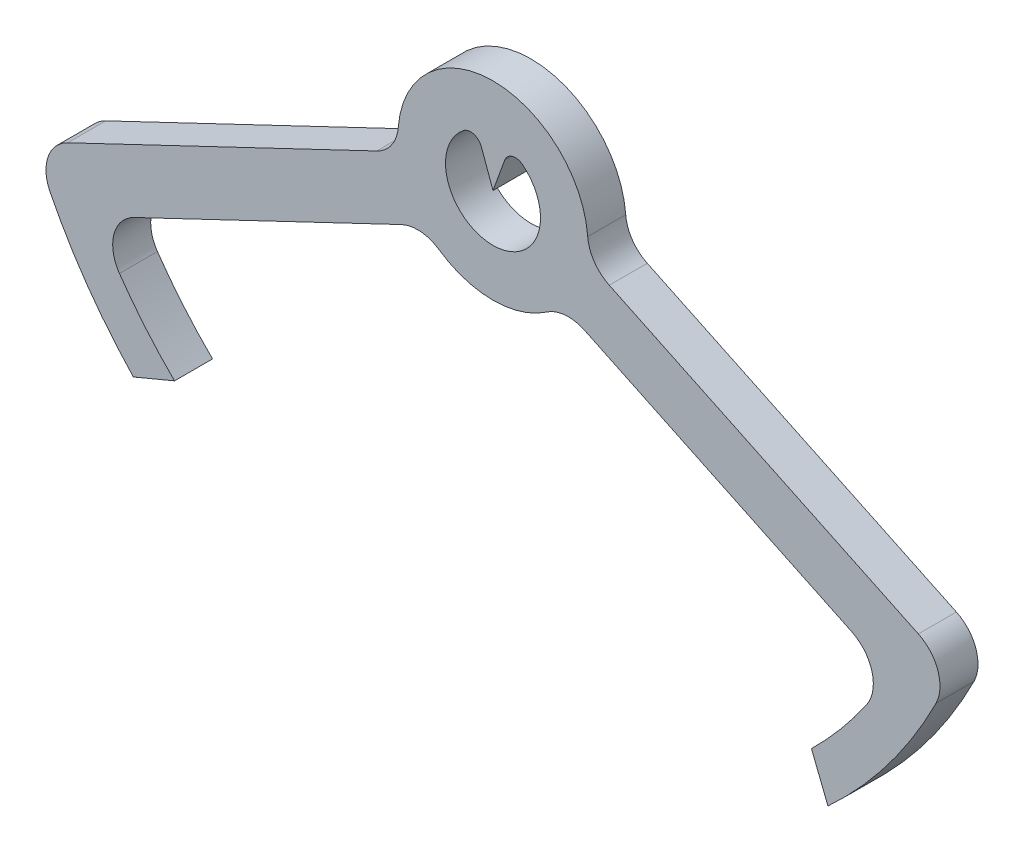
ISO-10303-21;
HEADER;
FILE_DESCRIPTION(('STEP AP214'),'2;1');
FILE_NAME('part.step','',(''),(''),'','','');
FILE_SCHEMA(('AUTOMOTIVE_DESIGN { 1 0 10303 214 1 1 1 1 }'));
ENDSEC;
DATA;
#1=APPLICATION_CONTEXT('core data for automotive mechanical design processes');
#2=APPLICATION_PROTOCOL_DEFINITION('international standard','automotive_design',2000,#1);
#3=PRODUCT_CONTEXT('',#1,'mechanical');
#4=PRODUCT('Part','Part','',(#3));
#5=PRODUCT_RELATED_PRODUCT_CATEGORY('part','',(#4));
#6=PRODUCT_DEFINITION_FORMATION('','',#4);
#7=PRODUCT_DEFINITION_CONTEXT('part definition',#1,'design');
#8=PRODUCT_DEFINITION('design','',#6,#7);
#9=PRODUCT_DEFINITION_SHAPE('','',#8);
#10=(LENGTH_UNIT() NAMED_UNIT(*) SI_UNIT(.MILLI.,.METRE.));
#11=(NAMED_UNIT(*) PLANE_ANGLE_UNIT() SI_UNIT($,.RADIAN.));
#12=(NAMED_UNIT(*) SI_UNIT($,.STERADIAN.) SOLID_ANGLE_UNIT());
#13=UNCERTAINTY_MEASURE_WITH_UNIT(LENGTH_MEASURE(1.E-05),#10,'distance_accuracy_value','');
#14=(GEOMETRIC_REPRESENTATION_CONTEXT(3) GLOBAL_UNCERTAINTY_ASSIGNED_CONTEXT((#13)) GLOBAL_UNIT_ASSIGNED_CONTEXT((#10,
#11,#12)) REPRESENTATION_CONTEXT('',''));
#15=CARTESIAN_POINT('',(0.,0.,0.));
#16=DIRECTION('',(0.,0.,1.));
#17=DIRECTION('',(1.,0.,0.));
#18=AXIS2_PLACEMENT_3D('',#15,#16,#17);
#19=CARTESIAN_POINT('',(0.,0.,10.));
#20=DIRECTION('',(0.,0.,-1.));
#21=DIRECTION('',(-1.,0.,0.));
#22=AXIS2_PLACEMENT_3D('',#19,#20,#21);
#23=CYLINDRICAL_SURFACE('',#22,12.5);
#24=CARTESIAN_POINT('',(0.,0.,10.));
#25=DIRECTION('',(0.,0.,1.));
#26=DIRECTION('',(1.,0.,0.));
#27=AXIS2_PLACEMENT_3D('',#24,#25,#26);
#28=CIRCLE('',#27,12.5);
#29=CARTESIAN_POINT('',(-7.76579706889906,9.79501893232876,10.));
#30=VERTEX_POINT('',#29);
#31=CARTESIAN_POINT('',(7.76579706889912,9.79501893232871,10.));
#32=VERTEX_POINT('',#31);
#33=EDGE_CURVE('E250',#30,#32,#28,.T.);
#34=ORIENTED_EDGE('',*,*,#33,.T.);
#35=DIRECTION('',(0.,0.,-1.));
#36=VECTOR('',#35,1.);
#37=CARTESIAN_POINT('',(7.76579706889912,9.79501893232871,10.));
#38=LINE('',#37,#36);
#39=CARTESIAN_POINT('',(7.76579706889912,9.79501893232871,0.));
#40=VERTEX_POINT('',#39);
#41=EDGE_CURVE('E378',#32,#40,#38,.T.);
#42=ORIENTED_EDGE('',*,*,#41,.T.);
#43=CARTESIAN_POINT('',(0.,0.,0.));
#44=DIRECTION('',(0.,0.,1.));
#45=DIRECTION('',(1.,0.,0.));
#46=AXIS2_PLACEMENT_3D('',#43,#44,#45);
#47=CIRCLE('',#46,12.5);
#48=CARTESIAN_POINT('',(-7.76579706889906,9.79501893232876,0.));
#49=VERTEX_POINT('',#48);
#50=EDGE_CURVE('E288',#49,#40,#47,.T.);
#51=ORIENTED_EDGE('',*,*,#50,.F.);
#52=DIRECTION('',(0.,0.,-1.));
#53=VECTOR('',#52,1.);
#54=CARTESIAN_POINT('',(-7.76579706889906,9.79501893232876,10.));
#55=LINE('',#54,#53);
#56=EDGE_CURVE('E376',#49,#30,#55,.F.);
#57=ORIENTED_EDGE('',*,*,#56,.T.);
#58=EDGE_LOOP('',(#34,#42,#51,#57));
#59=FACE_BOUND('',#58,.T.);
#60=ADVANCED_FACE('F35',(#59),#23,.F.);
#61=CARTESIAN_POINT('',(0.,0.,10.));
#62=DIRECTION('',(0.93969262078591,0.342020143325663,0.));
#63=DIRECTION('',(-0.342020143325663,0.939692620785911,0.));
#64=AXIS2_PLACEMENT_3D('',#61,#62,#63);
#65=PLANE('',#64);
#66=DIRECTION('',(0.342020143325663,-0.939692620785911,0.));
#67=VECTOR('',#66,1.);
#68=CARTESIAN_POINT('',(0.,0.,10.));
#69=LINE('',#68,#67);
#70=CARTESIAN_POINT('',(-3.08292791000555,8.47027481854685,10.));
#71=VERTEX_POINT('',#70);
#72=CARTESIAN_POINT('',(0.,0.,10.));
#73=VERTEX_POINT('',#72);
#74=EDGE_CURVE('E253',#71,#73,#69,.T.);
#75=ORIENTED_EDGE('',*,*,#74,.F.);
#76=DIRECTION('',(0.,0.,-1.));
#77=VECTOR('',#76,1.);
#78=CARTESIAN_POINT('',(-3.08292791000555,8.47027481854685,10.));
#79=LINE('',#78,#77);
#80=CARTESIAN_POINT('',(-3.08292791000555,8.47027481854685,0.));
#81=VERTEX_POINT('',#80);
#82=EDGE_CURVE('E383',#71,#81,#79,.T.);
#83=ORIENTED_EDGE('',*,*,#82,.T.);
#84=DIRECTION('',(0.342020143325663,-0.939692620785911,0.));
#85=VECTOR('',#84,1.);
#86=CARTESIAN_POINT('',(0.,0.,0.));
#87=LINE('',#86,#85);
#88=CARTESIAN_POINT('',(0.,0.,0.));
#89=VERTEX_POINT('',#88);
#90=EDGE_CURVE('E291',#81,#89,#87,.T.);
#91=ORIENTED_EDGE('',*,*,#90,.T.);
#92=DIRECTION('',(0.,0.,-1.));
#93=VECTOR('',#92,1.);
#94=CARTESIAN_POINT('',(0.,0.,10.));
#95=LINE('',#94,#93);
#96=EDGE_CURVE('E212',#73,#89,#95,.T.);
#97=ORIENTED_EDGE('',*,*,#96,.F.);
#98=EDGE_LOOP('',(#75,#83,#91,#97));
#99=FACE_BOUND('',#98,.T.);
#100=ADVANCED_FACE('F396',(#99),#65,.F.);
#101=CARTESIAN_POINT('',(3.22885710080164,-6.76937824490575,10.));
#102=DIRECTION('',(-0.430514280106884,0.90258376598743,0.));
#103=DIRECTION('',(-0.90258376598743,-0.430514280106884,0.));
#104=AXIS2_PLACEMENT_3D('',#101,#102,#103);
#105=PLANE('',#104);
#106=DIRECTION('',(0.90258376598743,0.430514280106884,0.));
#107=VECTOR('',#106,1.);
#108=CARTESIAN_POINT('',(3.22885710080164,-6.76937824490575,10.));
#109=LINE('',#108,#107);
#110=CARTESIAN_POINT('',(-94.3776142828172,-53.325699491744,10.));
#111=VERTEX_POINT('',#110);
#112=CARTESIAN_POINT('',(-24.1292593627974,-19.8186488591643,10.));
#113=VERTEX_POINT('',#112);
#114=EDGE_CURVE('E296',#111,#113,#109,.T.);
#115=ORIENTED_EDGE('',*,*,#114,.F.);
#116=DIRECTION('',(0.,0.,1.));
#117=VECTOR('',#116,1.);
#118=CARTESIAN_POINT('',(-94.3776142828172,-53.325699491744,0.));
#119=LINE('',#118,#117);
#120=CARTESIAN_POINT('',(-94.3776142828172,-53.325699491744,0.));
#121=VERTEX_POINT('',#120);
#122=EDGE_CURVE('E359',#111,#121,#119,.F.);
#123=ORIENTED_EDGE('',*,*,#122,.T.);
#124=DIRECTION('',(0.90258376598743,0.430514280106884,0.));
#125=VECTOR('',#124,1.);
#126=CARTESIAN_POINT('',(3.22885710080164,-6.76937824490575,0.));
#127=LINE('',#126,#125);
#128=CARTESIAN_POINT('',(-24.1292593627974,-19.8186488591643,0.));
#129=VERTEX_POINT('',#128);
#130=EDGE_CURVE('E259',#121,#129,#127,.T.);
#131=ORIENTED_EDGE('',*,*,#130,.T.);
#132=DIRECTION('',(0.,0.,1.));
#133=VECTOR('',#132,1.);
#134=CARTESIAN_POINT('',(-24.1292593627974,-19.8186488591643,10.));
#135=LINE('',#134,#133);
#136=EDGE_CURVE('E308',#129,#113,#135,.T.);
#137=ORIENTED_EDGE('',*,*,#136,.T.);
#138=EDGE_LOOP('',(#115,#123,#131,#137));
#139=FACE_BOUND('',#138,.T.);
#140=ADVANCED_FACE('F419',(#139),#105,.F.);
#141=CARTESIAN_POINT('',(0.,0.,10.));
#142=DIRECTION('',(0.,0.,-1.));
#143=DIRECTION('',(-1.,0.,0.));
#144=AXIS2_PLACEMENT_3D('',#141,#142,#143);
#145=CYLINDRICAL_SURFACE('',#144,25.);
#146=CARTESIAN_POINT('',(0.,0.,10.));
#147=DIRECTION('',(0.,0.,1.));
#148=DIRECTION('',(1.,0.,0.));
#149=AXIS2_PLACEMENT_3D('',#146,#147,#148);
#150=CIRCLE('',#149,25.);
#151=CARTESIAN_POINT('',(-14.1600832583775,-20.6032046564562,10.));
#152=VERTEX_POINT('',#151);
#153=CARTESIAN_POINT('',(14.1600832583774,-20.6032046564562,10.));
#154=VERTEX_POINT('',#153);
#155=EDGE_CURVE('E230',#152,#154,#150,.T.);
#156=ORIENTED_EDGE('',*,*,#155,.F.);
#157=DIRECTION('',(0.,0.,-1.));
#158=VECTOR('',#157,1.);
#159=CARTESIAN_POINT('',(-14.1600832583775,-20.6032046564562,10.));
#160=LINE('',#159,#158);
#161=CARTESIAN_POINT('',(-14.1600832583775,-20.6032046564562,0.));
#162=VERTEX_POINT('',#161);
#163=EDGE_CURVE('E305',#152,#162,#160,.T.);
#164=ORIENTED_EDGE('',*,*,#163,.T.);
#165=CARTESIAN_POINT('',(0.,0.,0.));
#166=DIRECTION('',(0.,0.,1.));
#167=DIRECTION('',(1.,0.,0.));
#168=AXIS2_PLACEMENT_3D('',#165,#166,#167);
#169=CIRCLE('',#168,25.);
#170=CARTESIAN_POINT('',(14.1600832583774,-20.6032046564562,0.));
#171=VERTEX_POINT('',#170);
#172=EDGE_CURVE('E261',#162,#171,#169,.T.);
#173=ORIENTED_EDGE('',*,*,#172,.T.);
#174=DIRECTION('',(0.,0.,-1.));
#175=VECTOR('',#174,1.);
#176=CARTESIAN_POINT('',(14.1600832583774,-20.6032046564562,10.));
#177=LINE('',#176,#175);
#178=EDGE_CURVE('E299',#171,#154,#177,.F.);
#179=ORIENTED_EDGE('',*,*,#178,.T.);
#180=EDGE_LOOP('',(#156,#164,#173,#179));
#181=FACE_BOUND('',#180,.T.);
#182=ADVANCED_FACE('F444',(#181),#145,.T.);
#183=CARTESIAN_POINT('',(-3.22885710080168,-6.76937824490571,10.));
#184=DIRECTION('',(0.43051428010689,0.902583765987427,0.));
#185=DIRECTION('',(-0.902583765987427,0.43051428010689,0.));
#186=AXIS2_PLACEMENT_3D('',#183,#184,#185);
#187=PLANE('',#186);
#188=DIRECTION('',(0.902583765987427,-0.43051428010689,0.));
#189=VECTOR('',#188,1.);
#190=CARTESIAN_POINT('',(-3.22885710080168,-6.76937824490571,0.));
#191=LINE('',#190,#189);
#192=CARTESIAN_POINT('',(24.1292593627972,-19.8186488591645,0.));
#193=VERTEX_POINT('',#192);
#194=CARTESIAN_POINT('',(94.3776142828168,-53.3256994917446,0.));
#195=VERTEX_POINT('',#194);
#196=EDGE_CURVE('E267',#193,#195,#191,.T.);
#197=ORIENTED_EDGE('',*,*,#196,.T.);
#198=DIRECTION('',(0.,0.,-1.));
#199=VECTOR('',#198,1.);
#200=CARTESIAN_POINT('',(94.3776142828168,-53.3256994917446,10.));
#201=LINE('',#200,#199);
#202=CARTESIAN_POINT('',(94.3776142828168,-53.3256994917446,10.));
#203=VERTEX_POINT('',#202);
#204=EDGE_CURVE('E357',#195,#203,#201,.F.);
#205=ORIENTED_EDGE('',*,*,#204,.T.);
#206=DIRECTION('',(0.902583765987427,-0.43051428010689,0.));
#207=VECTOR('',#206,1.);
#208=CARTESIAN_POINT('',(-3.22885710080168,-6.76937824490571,10.));
#209=LINE('',#208,#207);
#210=CARTESIAN_POINT('',(24.1292593627972,-19.8186488591645,10.));
#211=VERTEX_POINT('',#210);
#212=EDGE_CURVE('E228',#211,#203,#209,.T.);
#213=ORIENTED_EDGE('',*,*,#212,.F.);
#214=DIRECTION('',(0.,0.,1.));
#215=VECTOR('',#214,1.);
#216=CARTESIAN_POINT('',(24.1292593627972,-19.8186488591645,0.));
#217=LINE('',#216,#215);
#218=EDGE_CURVE('E311',#211,#193,#217,.F.);
#219=ORIENTED_EDGE('',*,*,#218,.T.);
#220=EDGE_LOOP('',(#197,#205,#213,#219));
#221=FACE_BOUND('',#220,.T.);
#222=ADVANCED_FACE('F456',(#221),#187,.F.);
#223=CARTESIAN_POINT('',(0.,0.,10.));
#224=DIRECTION('',(0.,0.,-1.));
#225=DIRECTION('',(-1.,0.,0.));
#226=AXIS2_PLACEMENT_3D('',#223,#224,#225);
#227=CYLINDRICAL_SURFACE('',#226,119.548);
#228=CARTESIAN_POINT('',(0.,0.,10.));
#229=DIRECTION('',(0.,0.,1.));
#230=DIRECTION('',(1.,0.,0.));
#231=AXIS2_PLACEMENT_3D('',#228,#229,#230);
#232=CIRCLE('',#231,119.548);
#233=CARTESIAN_POINT('',(83.792,-85.2679602195338,10.));
#234=VERTEX_POINT('',#233);
#235=CARTESIAN_POINT('',(98.2946637154489,-68.0432464618408,10.));
#236=VERTEX_POINT('',#235);
#237=EDGE_CURVE('E206',#234,#236,#232,.T.);
#238=ORIENTED_EDGE('',*,*,#237,.T.);
#239=DIRECTION('',(0.,0.,-1.));
#240=VECTOR('',#239,1.);
#241=CARTESIAN_POINT('',(98.2946637154489,-68.0432464618408,10.));
#242=LINE('',#241,#240);
#243=CARTESIAN_POINT('',(98.2946637154489,-68.0432464618408,0.));
#244=VERTEX_POINT('',#243);
#245=EDGE_CURVE('E355',#236,#244,#242,.T.);
#246=ORIENTED_EDGE('',*,*,#245,.T.);
#247=CARTESIAN_POINT('',(0.,0.,0.));
#248=DIRECTION('',(0.,0.,1.));
#249=DIRECTION('',(1.,0.,0.));
#250=AXIS2_PLACEMENT_3D('',#247,#248,#249);
#251=CIRCLE('',#250,119.548);
#252=CARTESIAN_POINT('',(83.792,-85.2679602195338,0.));
#253=VERTEX_POINT('',#252);
#254=EDGE_CURVE('E209',#253,#244,#251,.T.);
#255=ORIENTED_EDGE('',*,*,#254,.F.);
#256=DIRECTION('',(0.,0.,-1.));
#257=VECTOR('',#256,1.);
#258=CARTESIAN_POINT('',(83.792,-85.2679602195338,10.));
#259=LINE('',#258,#257);
#260=EDGE_CURVE('E201',#234,#253,#259,.T.);
#261=ORIENTED_EDGE('',*,*,#260,.F.);
#262=EDGE_LOOP('',(#238,#246,#255,#261));
#263=FACE_BOUND('',#262,.T.);
#264=ADVANCED_FACE('F203',(#263),#227,.F.);
#265=CARTESIAN_POINT('',(43.0668062153489,17.1285523734378,10.));
#266=DIRECTION('',(0.929205277797289,0.369564002188611,0.));
#267=DIRECTION('',(-0.369564002188611,0.929205277797289,0.));
#268=AXIS2_PLACEMENT_3D('',#265,#266,#267);
#269=PLANE('',#268);
#270=DIRECTION('',(0.369564002188611,-0.929205277797289,0.));
#271=VECTOR('',#270,1.);
#272=CARTESIAN_POINT('',(43.0668062153489,17.1285523734378,0.));
#273=LINE('',#272,#271);
#274=CARTESIAN_POINT('',(88.1317794736216,-96.1795911345693,0.));
#275=VERTEX_POINT('',#274);
#276=EDGE_CURVE('E271',#253,#275,#273,.T.);
#277=ORIENTED_EDGE('',*,*,#276,.T.);
#278=DIRECTION('',(0.,0.,-1.));
#279=VECTOR('',#278,1.);
#280=CARTESIAN_POINT('',(88.1317794736216,-96.1795911345693,10.));
#281=LINE('',#280,#279);
#282=CARTESIAN_POINT('',(88.1317794736216,-96.1795911345693,10.));
#283=VERTEX_POINT('',#282);
#284=EDGE_CURVE('E213',#283,#275,#281,.T.);
#285=ORIENTED_EDGE('',*,*,#284,.F.);
#286=DIRECTION('',(0.369564002188611,-0.929205277797289,0.));
#287=VECTOR('',#286,1.);
#288=CARTESIAN_POINT('',(43.0668062153489,17.1285523734378,10.));
#289=LINE('',#288,#287);
#290=EDGE_CURVE('E216',#234,#283,#289,.T.);
#291=ORIENTED_EDGE('',*,*,#290,.F.);
#292=ORIENTED_EDGE('',*,*,#260,.T.);
#293=EDGE_LOOP('',(#277,#285,#291,#292));
#294=FACE_BOUND('',#293,.T.);
#295=ADVANCED_FACE('F217',(#294),#269,.F.);
#296=CARTESIAN_POINT('',(0.,0.,10.));
#297=DIRECTION('',(0.,0.,-1.));
#298=DIRECTION('',(-1.,0.,0.));
#299=AXIS2_PLACEMENT_3D('',#296,#297,#298);
#300=CYLINDRICAL_SURFACE('',#299,130.452);
#301=CARTESIAN_POINT('',(0.,0.,0.));
#302=DIRECTION('',(0.,0.,1.));
#303=DIRECTION('',(1.,0.,0.));
#304=AXIS2_PLACEMENT_3D('',#301,#302,#303);
#305=CIRCLE('',#304,130.452);
#306=CARTESIAN_POINT('',(116.552854457499,-58.5931431296278,0.));
#307=VERTEX_POINT('',#306);
#308=EDGE_CURVE('E273',#275,#307,#305,.T.);
#309=ORIENTED_EDGE('',*,*,#308,.T.);
#310=DIRECTION('',(0.,0.,-1.));
#311=VECTOR('',#310,1.);
#312=CARTESIAN_POINT('',(116.552854457499,-58.5931431296278,10.));
#313=LINE('',#312,#311);
#314=CARTESIAN_POINT('',(116.552854457499,-58.5931431296278,10.));
#315=VERTEX_POINT('',#314);
#316=EDGE_CURVE('E349',#307,#315,#313,.F.);
#317=ORIENTED_EDGE('',*,*,#316,.T.);
#318=CARTESIAN_POINT('',(0.,0.,10.));
#319=DIRECTION('',(0.,0.,1.));
#320=DIRECTION('',(1.,0.,0.));
#321=AXIS2_PLACEMENT_3D('',#318,#319,#320);
#322=CIRCLE('',#321,130.452);
#323=EDGE_CURVE('E222',#283,#315,#322,.T.);
#324=ORIENTED_EDGE('',*,*,#323,.F.);
#325=ORIENTED_EDGE('',*,*,#284,.T.);
#326=EDGE_LOOP('',(#309,#317,#324,#325));
#327=FACE_BOUND('',#326,.T.);
#328=ADVANCED_FACE('F447',(#327),#300,.T.);
#329=CARTESIAN_POINT('',(3.22885710080168,6.7693782449057,10.));
#330=DIRECTION('',(0.43051428010689,0.902583765987427,0.));
#331=DIRECTION('',(-0.902583765987427,0.43051428010689,0.));
#332=AXIS2_PLACEMENT_3D('',#329,#330,#331);
#333=PLANE('',#332);
#334=DIRECTION('',(0.902583765987427,-0.43051428010689,0.));
#335=VECTOR('',#334,1.);
#336=CARTESIAN_POINT('',(3.22885710080168,6.7693782449057,10.));
#337=LINE('',#336,#335);
#338=CARTESIAN_POINT('',(30.5869735644006,-6.27989236935308,10.));
#339=VERTEX_POINT('',#338);
#340=CARTESIAN_POINT('',(111.923457776038,-45.0757573808298,10.));
#341=VERTEX_POINT('',#340);
#342=EDGE_CURVE('E235',#339,#341,#337,.T.);
#343=ORIENTED_EDGE('',*,*,#342,.T.);
#344=DIRECTION('',(0.,0.,1.));
#345=VECTOR('',#344,1.);
#346=CARTESIAN_POINT('',(111.923457776038,-45.0757573808298,0.));
#347=LINE('',#346,#345);
#348=CARTESIAN_POINT('',(111.923457776038,-45.0757573808298,0.));
#349=VERTEX_POINT('',#348);
#350=EDGE_CURVE('E342',#341,#349,#347,.F.);
#351=ORIENTED_EDGE('',*,*,#350,.T.);
#352=DIRECTION('',(0.902583765987427,-0.43051428010689,0.));
#353=VECTOR('',#352,1.);
#354=CARTESIAN_POINT('',(3.22885710080168,6.7693782449057,0.));
#355=LINE('',#354,#353);
#356=CARTESIAN_POINT('',(30.5869735644006,-6.27989236935308,0.));
#357=VERTEX_POINT('',#356);
#358=EDGE_CURVE('E266',#357,#349,#355,.T.);
#359=ORIENTED_EDGE('',*,*,#358,.F.);
#360=DIRECTION('',(0.,0.,-1.));
#361=VECTOR('',#360,1.);
#362=CARTESIAN_POINT('',(30.5869735644006,-6.27989236935308,10.));
#363=LINE('',#362,#361);
#364=EDGE_CURVE('E319',#357,#339,#363,.F.);
#365=ORIENTED_EDGE('',*,*,#364,.T.);
#366=EDGE_LOOP('',(#343,#351,#359,#365));
#367=FACE_BOUND('',#366,.T.);
#368=ADVANCED_FACE('F442',(#367),#333,.T.);
#369=CARTESIAN_POINT('',(24.9229402610496,1.96138949322942,10.));
#370=VERTEX_POINT('',#369);
#371=CARTESIAN_POINT('',(-24.9229402610496,1.96138949322959,10.));
#372=VERTEX_POINT('',#371);
#373=EDGE_CURVE('E238',#370,#372,#150,.T.);
#374=ORIENTED_EDGE('',*,*,#373,.F.);
#375=DIRECTION('',(0.,0.,-1.));
#376=VECTOR('',#375,1.);
#377=CARTESIAN_POINT('',(24.9229402610496,1.96138949322942,10.));
#378=LINE('',#377,#376);
#379=CARTESIAN_POINT('',(24.9229402610496,1.96138949322942,0.));
#380=VERTEX_POINT('',#379);
#381=EDGE_CURVE('E316',#370,#380,#378,.T.);
#382=ORIENTED_EDGE('',*,*,#381,.T.);
#383=CARTESIAN_POINT('',(-24.9229402610496,1.96138949322959,0.));
#384=VERTEX_POINT('',#383);
#385=EDGE_CURVE('E262',#380,#384,#169,.T.);
#386=ORIENTED_EDGE('',*,*,#385,.T.);
#387=DIRECTION('',(0.,0.,-1.));
#388=VECTOR('',#387,1.);
#389=CARTESIAN_POINT('',(-24.9229402610496,1.96138949322959,10.));
#390=LINE('',#389,#388);
#391=EDGE_CURVE('E314',#384,#372,#390,.F.);
#392=ORIENTED_EDGE('',*,*,#391,.T.);
#393=EDGE_LOOP('',(#374,#382,#386,#392));
#394=FACE_BOUND('',#393,.T.);
#395=ADVANCED_FACE('F438',(#394),#145,.T.);
#396=CARTESIAN_POINT('',(-3.22885710080163,6.76937824490572,10.));
#397=DIRECTION('',(-0.430514280106884,0.90258376598743,0.));
#398=DIRECTION('',(-0.90258376598743,-0.430514280106884,0.));
#399=AXIS2_PLACEMENT_3D('',#396,#397,#398);
#400=PLANE('',#399);
#401=DIRECTION('',(0.90258376598743,0.430514280106884,0.));
#402=VECTOR('',#401,1.);
#403=CARTESIAN_POINT('',(-3.22885710080163,6.76937824490572,0.));
#404=LINE('',#403,#402);
#405=CARTESIAN_POINT('',(-111.923457776038,-45.0757573808291,0.));
#406=VERTEX_POINT('',#405);
#407=CARTESIAN_POINT('',(-30.5869735644006,-6.27989236935288,0.));
#408=VERTEX_POINT('',#407);
#409=EDGE_CURVE('E265',#406,#408,#404,.T.);
#410=ORIENTED_EDGE('',*,*,#409,.F.);
#411=DIRECTION('',(0.,0.,-1.));
#412=VECTOR('',#411,1.);
#413=CARTESIAN_POINT('',(-111.923457776038,-45.0757573808291,10.));
#414=LINE('',#413,#412);
#415=CARTESIAN_POINT('',(-111.923457776038,-45.0757573808291,10.));
#416=VERTEX_POINT('',#415);
#417=EDGE_CURVE('E367',#406,#416,#414,.F.);
#418=ORIENTED_EDGE('',*,*,#417,.T.);
#419=DIRECTION('',(0.90258376598743,0.430514280106884,0.));
#420=VECTOR('',#419,1.);
#421=CARTESIAN_POINT('',(-3.22885710080163,6.76937824490572,10.));
#422=LINE('',#421,#420);
#423=CARTESIAN_POINT('',(-30.5869735644006,-6.27989236935288,10.));
#424=VERTEX_POINT('',#423);
#425=EDGE_CURVE('E239',#416,#424,#422,.T.);
#426=ORIENTED_EDGE('',*,*,#425,.T.);
#427=DIRECTION('',(0.,0.,-1.));
#428=VECTOR('',#427,1.);
#429=CARTESIAN_POINT('',(-30.5869735644006,-6.27989236935287,10.));
#430=LINE('',#429,#428);
#431=EDGE_CURVE('E321',#424,#408,#430,.T.);
#432=ORIENTED_EDGE('',*,*,#431,.T.);
#433=EDGE_LOOP('',(#410,#418,#426,#432));
#434=FACE_BOUND('',#433,.T.);
#435=ADVANCED_FACE('F434',(#434),#400,.T.);
#436=CARTESIAN_POINT('',(0.,0.,10.));
#437=DIRECTION('',(0.,0.,-1.));
#438=DIRECTION('',(-1.,0.,0.));
#439=AXIS2_PLACEMENT_3D('',#436,#437,#438);
#440=CYLINDRICAL_SURFACE('',#439,130.452);
#441=CARTESIAN_POINT('',(0.,0.,10.));
#442=DIRECTION('',(0.,0.,1.));
#443=DIRECTION('',(1.,0.,0.));
#444=AXIS2_PLACEMENT_3D('',#441,#442,#443);
#445=CIRCLE('',#444,130.452);
#446=CARTESIAN_POINT('',(-94.6261974750139,-89.7975893630763,10.));
#447=VERTEX_POINT('',#446);
#448=CARTESIAN_POINT('',(-116.552854457499,-58.593143129627,10.));
#449=VERTEX_POINT('',#448);
#450=EDGE_CURVE('E241',#447,#449,#445,.F.);
#451=ORIENTED_EDGE('',*,*,#450,.T.);
#452=DIRECTION('',(0.,0.,-1.));
#453=VECTOR('',#452,1.);
#454=CARTESIAN_POINT('',(-116.552854457499,-58.593143129627,10.));
#455=LINE('',#454,#453);
#456=CARTESIAN_POINT('',(-116.552854457499,-58.593143129627,0.));
#457=VERTEX_POINT('',#456);
#458=EDGE_CURVE('E364',#449,#457,#455,.T.);
#459=ORIENTED_EDGE('',*,*,#458,.T.);
#460=CARTESIAN_POINT('',(0.,0.,0.));
#461=DIRECTION('',(0.,0.,1.));
#462=DIRECTION('',(1.,0.,0.));
#463=AXIS2_PLACEMENT_3D('',#460,#461,#462);
#464=CIRCLE('',#463,130.452);
#465=CARTESIAN_POINT('',(-94.6261974750139,-89.7975893630763,0.));
#466=VERTEX_POINT('',#465);
#467=EDGE_CURVE('E279',#466,#457,#464,.F.);
#468=ORIENTED_EDGE('',*,*,#467,.F.);
#469=DIRECTION('',(0.,0.,-1.));
#470=VECTOR('',#469,1.);
#471=CARTESIAN_POINT('',(-94.6261974750139,-89.7975893630763,10.));
#472=LINE('',#471,#470);
#473=EDGE_CURVE('E301',#447,#466,#472,.T.);
#474=ORIENTED_EDGE('',*,*,#473,.F.);
#475=EDGE_LOOP('',(#451,#459,#468,#474));
#476=FACE_BOUND('',#475,.T.);
#477=ADVANCED_FACE('F430',(#476),#440,.T.);
#478=CARTESIAN_POINT('',(17.8778646447378,-42.7611863697028,10.));
#479=DIRECTION('',(0.385731091842964,-0.922611253337848,0.));
#480=DIRECTION('',(0.922611253337848,0.385731091842964,0.));
#481=AXIS2_PLACEMENT_3D('',#478,#479,#480);
#482=PLANE('',#481);
#483=DIRECTION('',(-0.922611253337848,-0.385731091842964,0.));
#484=VECTOR('',#483,1.);
#485=CARTESIAN_POINT('',(17.8778646447378,-42.7611863697028,0.));
#486=LINE('',#485,#484);
#487=CARTESIAN_POINT('',(-83.792,-85.2679602195338,0.));
#488=VERTEX_POINT('',#487);
#489=EDGE_CURVE('E282',#488,#466,#486,.T.);
#490=ORIENTED_EDGE('',*,*,#489,.F.);
#491=DIRECTION('',(0.,0.,-1.));
#492=VECTOR('',#491,1.);
#493=CARTESIAN_POINT('',(-83.792,-85.2679602195338,10.));
#494=LINE('',#493,#492);
#495=CARTESIAN_POINT('',(-83.792,-85.2679602195338,10.));
#496=VERTEX_POINT('',#495);
#497=EDGE_CURVE('E258',#496,#488,#494,.T.);
#498=ORIENTED_EDGE('',*,*,#497,.F.);
#499=DIRECTION('',(-0.922611253337848,-0.385731091842964,0.));
#500=VECTOR('',#499,1.);
#501=CARTESIAN_POINT('',(17.8778646447378,-42.7611863697028,10.));
#502=LINE('',#501,#500);
#503=EDGE_CURVE('E244',#496,#447,#502,.T.);
#504=ORIENTED_EDGE('',*,*,#503,.T.);
#505=ORIENTED_EDGE('',*,*,#473,.T.);
#506=EDGE_LOOP('',(#490,#498,#504,#505));
#507=FACE_BOUND('',#506,.T.);
#508=ADVANCED_FACE('F426',(#507),#482,.T.);
#509=CARTESIAN_POINT('',(0.,0.,10.));
#510=DIRECTION('',(0.,0.,-1.));
#511=DIRECTION('',(-1.,0.,0.));
#512=AXIS2_PLACEMENT_3D('',#509,#510,#511);
#513=CYLINDRICAL_SURFACE('',#512,119.548);
#514=CARTESIAN_POINT('',(0.,0.,0.));
#515=DIRECTION('',(0.,0.,1.));
#516=DIRECTION('',(1.,0.,0.));
#517=AXIS2_PLACEMENT_3D('',#514,#515,#516);
#518=CIRCLE('',#517,119.548);
#519=CARTESIAN_POINT('',(-98.2946637154494,-68.0432464618401,0.));
#520=VERTEX_POINT('',#519);
#521=EDGE_CURVE('E285',#488,#520,#518,.F.);
#522=ORIENTED_EDGE('',*,*,#521,.T.);
#523=DIRECTION('',(0.,0.,-1.));
#524=VECTOR('',#523,1.);
#525=CARTESIAN_POINT('',(-98.2946637154494,-68.0432464618401,10.));
#526=LINE('',#525,#524);
#527=CARTESIAN_POINT('',(-98.2946637154494,-68.0432464618401,10.));
#528=VERTEX_POINT('',#527);
#529=EDGE_CURVE('E362',#520,#528,#526,.F.);
#530=ORIENTED_EDGE('',*,*,#529,.T.);
#531=CARTESIAN_POINT('',(0.,0.,10.));
#532=DIRECTION('',(0.,0.,1.));
#533=DIRECTION('',(1.,0.,0.));
#534=AXIS2_PLACEMENT_3D('',#531,#532,#533);
#535=CIRCLE('',#534,119.548);
#536=EDGE_CURVE('E247',#496,#528,#535,.F.);
#537=ORIENTED_EDGE('',*,*,#536,.F.);
#538=ORIENTED_EDGE('',*,*,#497,.T.);
#539=EDGE_LOOP('',(#522,#530,#537,#538));
#540=FACE_BOUND('',#539,.T.);
#541=ADVANCED_FACE('F423',(#540),#513,.F.);
#542=CARTESIAN_POINT('',(0.,0.,10.));
#543=DIRECTION('',(-0.939692620785908,0.342020143325669,0.));
#544=DIRECTION('',(-0.342020143325669,-0.939692620785908,0.));
#545=AXIS2_PLACEMENT_3D('',#542,#543,#544);
#546=PLANE('',#545);
#547=DIRECTION('',(0.342020143325669,0.939692620785908,0.));
#548=VECTOR('',#547,1.);
#549=CARTESIAN_POINT('',(0.,0.,0.));
#550=LINE('',#549,#548);
#551=CARTESIAN_POINT('',(3.08292791000561,8.47027481854682,0.));
#552=VERTEX_POINT('',#551);
#553=EDGE_CURVE('E293',#89,#552,#550,.T.);
#554=ORIENTED_EDGE('',*,*,#553,.T.);
#555=DIRECTION('',(0.,0.,-1.));
#556=VECTOR('',#555,1.);
#557=CARTESIAN_POINT('',(3.08292791000561,8.47027481854682,10.));
#558=LINE('',#557,#556);
#559=CARTESIAN_POINT('',(3.08292791000561,8.47027481854682,10.));
#560=VERTEX_POINT('',#559);
#561=EDGE_CURVE('E381',#552,#560,#558,.F.);
#562=ORIENTED_EDGE('',*,*,#561,.T.);
#563=DIRECTION('',(0.342020143325669,0.939692620785908,0.));
#564=VECTOR('',#563,1.);
#565=CARTESIAN_POINT('',(0.,0.,10.));
#566=LINE('',#565,#564);
#567=EDGE_CURVE('E255',#73,#560,#566,.T.);
#568=ORIENTED_EDGE('',*,*,#567,.F.);
#569=ORIENTED_EDGE('',*,*,#96,.T.);
#570=EDGE_LOOP('',(#554,#562,#568,#569));
#571=FACE_BOUND('',#570,.T.);
#572=ADVANCED_FACE('F401',(#571),#546,.F.);
#573=CARTESIAN_POINT('',(0.,0.,10.));
#574=DIRECTION('',(0.,0.,1.));
#575=DIRECTION('',(1.,0.,0.));
#576=AXIS2_PLACEMENT_3D('',#573,#574,#575);
#577=PLANE('',#576);
#578=ORIENTED_EDGE('',*,*,#323,.T.);
#579=CARTESIAN_POINT('',(107.618314974969,-54.1015950407041,10.));
#580=DIRECTION('',(0.,0.,1.));
#581=DIRECTION('',(1.,0.,0.));
#582=AXIS2_PLACEMENT_3D('',#579,#580,#581);
#583=CIRCLE('',#582,10.);
#584=EDGE_CURVE('E353',#315,#341,#583,.T.);
#585=ORIENTED_EDGE('',*,*,#584,.T.);
#586=ORIENTED_EDGE('',*,*,#342,.F.);
#587=CARTESIAN_POINT('',(34.8921163654695,2.74594529052119,10.));
#588=DIRECTION('',(0.,0.,1.));
#589=DIRECTION('',(1.,0.,0.));
#590=AXIS2_PLACEMENT_3D('',#587,#588,#589);
#591=CIRCLE('',#590,10.);
#592=EDGE_CURVE('E335',#339,#370,#591,.F.);
#593=ORIENTED_EDGE('',*,*,#592,.T.);
#594=ORIENTED_EDGE('',*,*,#373,.T.);
#595=CARTESIAN_POINT('',(-34.8921163654695,2.74594529052142,10.));
#596=DIRECTION('',(0.,0.,1.));
#597=DIRECTION('',(1.,0.,0.));
#598=AXIS2_PLACEMENT_3D('',#595,#596,#597);
#599=CIRCLE('',#598,10.);
#600=EDGE_CURVE('E339',#372,#424,#599,.F.);
#601=ORIENTED_EDGE('',*,*,#600,.T.);
#602=ORIENTED_EDGE('',*,*,#425,.F.);
#603=CARTESIAN_POINT('',(-107.618314974969,-54.1015950407034,10.));
#604=DIRECTION('',(0.,0.,1.));
#605=DIRECTION('',(1.,0.,0.));
#606=AXIS2_PLACEMENT_3D('',#603,#604,#605);
#607=CIRCLE('',#606,10.);
#608=EDGE_CURVE('E351',#416,#449,#607,.T.);
#609=ORIENTED_EDGE('',*,*,#608,.T.);
#610=ORIENTED_EDGE('',*,*,#450,.F.);
#611=ORIENTED_EDGE('',*,*,#503,.F.);
#612=ORIENTED_EDGE('',*,*,#536,.T.);
#613=CARTESIAN_POINT('',(-90.0724714817484,-62.3515371516183,10.));
#614=DIRECTION('',(0.,0.,1.));
#615=DIRECTION('',(1.,0.,0.));
#616=AXIS2_PLACEMENT_3D('',#613,#614,#615);
#617=CIRCLE('',#616,10.);
#618=EDGE_CURVE('E374',#528,#111,#617,.F.);
#619=ORIENTED_EDGE('',*,*,#618,.T.);
#620=ORIENTED_EDGE('',*,*,#114,.T.);
#621=CARTESIAN_POINT('',(-19.8241165617285,-28.8444865190386,10.));
#622=DIRECTION('',(0.,0.,1.));
#623=DIRECTION('',(1.,0.,0.));
#624=AXIS2_PLACEMENT_3D('',#621,#622,#623);
#625=CIRCLE('',#624,10.);
#626=EDGE_CURVE('E327',#113,#152,#625,.F.);
#627=ORIENTED_EDGE('',*,*,#626,.T.);
#628=ORIENTED_EDGE('',*,*,#155,.T.);
#629=CARTESIAN_POINT('',(19.8241165617283,-28.8444865190388,10.));
#630=DIRECTION('',(0.,0.,1.));
#631=DIRECTION('',(1.,0.,0.));
#632=AXIS2_PLACEMENT_3D('',#629,#630,#631);
#633=CIRCLE('',#632,10.);
#634=EDGE_CURVE('E331',#154,#211,#633,.F.);
#635=ORIENTED_EDGE('',*,*,#634,.T.);
#636=ORIENTED_EDGE('',*,*,#212,.T.);
#637=CARTESIAN_POINT('',(90.0724714817479,-62.3515371516189,10.));
#638=DIRECTION('',(0.,0.,1.));
#639=DIRECTION('',(1.,0.,0.));
#640=AXIS2_PLACEMENT_3D('',#637,#638,#639);
#641=CIRCLE('',#640,10.);
#642=EDGE_CURVE('E227',#203,#236,#641,.F.);
#643=ORIENTED_EDGE('',*,*,#642,.T.);
#644=ORIENTED_EDGE('',*,*,#237,.F.);
#645=ORIENTED_EDGE('',*,*,#290,.T.);
#646=EDGE_LOOP('',(#578,#585,#586,#593,#594,#601,#602,#609,#610,#611,#612,#619,#620,#627,#628,
#635,#636,#643,#644,#645));
#647=FACE_BOUND('',#646,.T.);
#648=ORIENTED_EDGE('',*,*,#33,.F.);
#649=CARTESIAN_POINT('',(-5.90200577236328,7.44421438856986,10.));
#650=DIRECTION('',(0.,0.,1.));
#651=DIRECTION('',(1.,0.,0.));
#652=AXIS2_PLACEMENT_3D('',#649,#650,#651);
#653=CIRCLE('',#652,3.);
#654=EDGE_CURVE('E11',#30,#71,#653,.F.);
#655=ORIENTED_EDGE('',*,*,#654,.T.);
#656=ORIENTED_EDGE('',*,*,#74,.T.);
#657=ORIENTED_EDGE('',*,*,#567,.T.);
#658=CARTESIAN_POINT('',(5.90200577236334,7.44421438856982,10.));
#659=DIRECTION('',(0.,0.,1.));
#660=DIRECTION('',(1.,0.,0.));
#661=AXIS2_PLACEMENT_3D('',#658,#659,#660);
#662=CIRCLE('',#661,3.);
#663=EDGE_CURVE('E387',#560,#32,#662,.F.);
#664=ORIENTED_EDGE('',*,*,#663,.T.);
#665=EDGE_LOOP('',(#648,#655,#656,#657,#664));
#666=FACE_BOUND('',#665,.T.);
#667=ADVANCED_FACE('F224',(#647,#666),#577,.T.);
#668=CARTESIAN_POINT('',(0.,0.,0.));
#669=DIRECTION('',(0.,0.,1.));
#670=DIRECTION('',(1.,0.,0.));
#671=AXIS2_PLACEMENT_3D('',#668,#669,#670);
#672=PLANE('',#671);
#673=ORIENTED_EDGE('',*,*,#358,.T.);
#674=CARTESIAN_POINT('',(107.618314974969,-54.1015950407041,0.));
#675=DIRECTION('',(0.,0.,1.));
#676=DIRECTION('',(1.,0.,0.));
#677=AXIS2_PLACEMENT_3D('',#674,#675,#676);
#678=CIRCLE('',#677,10.);
#679=EDGE_CURVE('E347',#349,#307,#678,.F.);
#680=ORIENTED_EDGE('',*,*,#679,.T.);
#681=ORIENTED_EDGE('',*,*,#308,.F.);
#682=ORIENTED_EDGE('',*,*,#276,.F.);
#683=ORIENTED_EDGE('',*,*,#254,.T.);
#684=CARTESIAN_POINT('',(90.0724714817479,-62.3515371516189,0.));
#685=DIRECTION('',(0.,0.,1.));
#686=DIRECTION('',(1.,0.,0.));
#687=AXIS2_PLACEMENT_3D('',#684,#685,#686);
#688=CIRCLE('',#687,10.);
#689=EDGE_CURVE('E369',#244,#195,#688,.T.);
#690=ORIENTED_EDGE('',*,*,#689,.T.);
#691=ORIENTED_EDGE('',*,*,#196,.F.);
#692=CARTESIAN_POINT('',(19.8241165617283,-28.8444865190388,0.));
#693=DIRECTION('',(0.,0.,1.));
#694=DIRECTION('',(1.,0.,0.));
#695=AXIS2_PLACEMENT_3D('',#692,#693,#694);
#696=CIRCLE('',#695,10.);
#697=EDGE_CURVE('E329',#193,#171,#696,.T.);
#698=ORIENTED_EDGE('',*,*,#697,.T.);
#699=ORIENTED_EDGE('',*,*,#172,.F.);
#700=CARTESIAN_POINT('',(-19.8241165617285,-28.8444865190386,0.));
#701=DIRECTION('',(0.,0.,1.));
#702=DIRECTION('',(1.,0.,0.));
#703=AXIS2_PLACEMENT_3D('',#700,#701,#702);
#704=CIRCLE('',#703,10.);
#705=EDGE_CURVE('E324',#162,#129,#704,.T.);
#706=ORIENTED_EDGE('',*,*,#705,.T.);
#707=ORIENTED_EDGE('',*,*,#130,.F.);
#708=CARTESIAN_POINT('',(-90.0724714817484,-62.3515371516183,0.));
#709=DIRECTION('',(0.,0.,1.));
#710=DIRECTION('',(1.,0.,0.));
#711=AXIS2_PLACEMENT_3D('',#708,#709,#710);
#712=CIRCLE('',#711,10.);
#713=EDGE_CURVE('E372',#121,#520,#712,.T.);
#714=ORIENTED_EDGE('',*,*,#713,.T.);
#715=ORIENTED_EDGE('',*,*,#521,.F.);
#716=ORIENTED_EDGE('',*,*,#489,.T.);
#717=ORIENTED_EDGE('',*,*,#467,.T.);
#718=CARTESIAN_POINT('',(-107.618314974969,-54.1015950407034,0.));
#719=DIRECTION('',(0.,0.,1.));
#720=DIRECTION('',(1.,0.,0.));
#721=AXIS2_PLACEMENT_3D('',#718,#719,#720);
#722=CIRCLE('',#721,10.);
#723=EDGE_CURVE('E345',#457,#406,#722,.F.);
#724=ORIENTED_EDGE('',*,*,#723,.T.);
#725=ORIENTED_EDGE('',*,*,#409,.T.);
#726=CARTESIAN_POINT('',(-34.8921163654695,2.74594529052142,0.));
#727=DIRECTION('',(0.,0.,1.));
#728=DIRECTION('',(1.,0.,0.));
#729=AXIS2_PLACEMENT_3D('',#726,#727,#728);
#730=CIRCLE('',#729,10.);
#731=EDGE_CURVE('E337',#408,#384,#730,.T.);
#732=ORIENTED_EDGE('',*,*,#731,.T.);
#733=ORIENTED_EDGE('',*,*,#385,.F.);
#734=CARTESIAN_POINT('',(34.8921163654695,2.74594529052119,0.));
#735=DIRECTION('',(0.,0.,1.));
#736=DIRECTION('',(1.,0.,0.));
#737=AXIS2_PLACEMENT_3D('',#734,#735,#736);
#738=CIRCLE('',#737,10.);
#739=EDGE_CURVE('E333',#380,#357,#738,.T.);
#740=ORIENTED_EDGE('',*,*,#739,.T.);
#741=EDGE_LOOP('',(#673,#680,#681,#682,#683,#690,#691,#698,#699,#706,#707,#714,#715,#716,#717,
#724,#725,#732,#733,#740));
#742=FACE_BOUND('',#741,.T.);
#743=ORIENTED_EDGE('',*,*,#90,.F.);
#744=CARTESIAN_POINT('',(-5.90200577236328,7.44421438856986,0.));
#745=DIRECTION('',(0.,0.,1.));
#746=DIRECTION('',(1.,0.,0.));
#747=AXIS2_PLACEMENT_3D('',#744,#745,#746);
#748=CIRCLE('',#747,3.);
#749=EDGE_CURVE('E43',#81,#49,#748,.T.);
#750=ORIENTED_EDGE('',*,*,#749,.T.);
#751=ORIENTED_EDGE('',*,*,#50,.T.);
#752=CARTESIAN_POINT('',(5.90200577236334,7.44421438856982,0.));
#753=DIRECTION('',(0.,0.,1.));
#754=DIRECTION('',(1.,0.,0.));
#755=AXIS2_PLACEMENT_3D('',#752,#753,#754);
#756=CIRCLE('',#755,3.);
#757=EDGE_CURVE('E385',#40,#552,#756,.T.);
#758=ORIENTED_EDGE('',*,*,#757,.T.);
#759=ORIENTED_EDGE('',*,*,#553,.F.);
#760=EDGE_LOOP('',(#743,#750,#751,#758,#759));
#761=FACE_BOUND('',#760,.T.);
#762=ADVANCED_FACE('F391',(#742,#761),#672,.F.);
#763=CARTESIAN_POINT('',(-19.8241165617285,-28.8444865190386,10.));
#764=DIRECTION('',(0.,0.,-1.));
#765=DIRECTION('',(-1.,0.,0.));
#766=AXIS2_PLACEMENT_3D('',#763,#764,#765);
#767=CYLINDRICAL_SURFACE('',#766,10.);
#768=ORIENTED_EDGE('',*,*,#626,.F.);
#769=ORIENTED_EDGE('',*,*,#136,.F.);
#770=ORIENTED_EDGE('',*,*,#705,.F.);
#771=ORIENTED_EDGE('',*,*,#163,.F.);
#772=EDGE_LOOP('',(#768,#769,#770,#771));
#773=FACE_BOUND('',#772,.T.);
#774=ADVANCED_FACE('F463',(#773),#767,.F.);
#775=CARTESIAN_POINT('',(19.8241165617283,-28.8444865190388,10.));
#776=DIRECTION('',(0.,0.,-1.));
#777=DIRECTION('',(-1.,0.,0.));
#778=AXIS2_PLACEMENT_3D('',#775,#776,#777);
#779=CYLINDRICAL_SURFACE('',#778,10.);
#780=ORIENTED_EDGE('',*,*,#634,.F.);
#781=ORIENTED_EDGE('',*,*,#178,.F.);
#782=ORIENTED_EDGE('',*,*,#697,.F.);
#783=ORIENTED_EDGE('',*,*,#218,.F.);
#784=EDGE_LOOP('',(#780,#781,#782,#783));
#785=FACE_BOUND('',#784,.T.);
#786=ADVANCED_FACE('F466',(#785),#779,.F.);
#787=CARTESIAN_POINT('',(34.8921163654695,2.74594529052119,10.));
#788=DIRECTION('',(0.,0.,-1.));
#789=DIRECTION('',(-1.,0.,0.));
#790=AXIS2_PLACEMENT_3D('',#787,#788,#789);
#791=CYLINDRICAL_SURFACE('',#790,10.);
#792=ORIENTED_EDGE('',*,*,#592,.F.);
#793=ORIENTED_EDGE('',*,*,#364,.F.);
#794=ORIENTED_EDGE('',*,*,#739,.F.);
#795=ORIENTED_EDGE('',*,*,#381,.F.);
#796=EDGE_LOOP('',(#792,#793,#794,#795));
#797=FACE_BOUND('',#796,.T.);
#798=ADVANCED_FACE('F470',(#797),#791,.F.);
#799=CARTESIAN_POINT('',(-34.8921163654695,2.74594529052142,10.));
#800=DIRECTION('',(0.,0.,-1.));
#801=DIRECTION('',(-1.,0.,0.));
#802=AXIS2_PLACEMENT_3D('',#799,#800,#801);
#803=CYLINDRICAL_SURFACE('',#802,10.);
#804=ORIENTED_EDGE('',*,*,#600,.F.);
#805=ORIENTED_EDGE('',*,*,#391,.F.);
#806=ORIENTED_EDGE('',*,*,#731,.F.);
#807=ORIENTED_EDGE('',*,*,#431,.F.);
#808=EDGE_LOOP('',(#804,#805,#806,#807));
#809=FACE_BOUND('',#808,.T.);
#810=ADVANCED_FACE('F474',(#809),#803,.F.);
#811=CARTESIAN_POINT('',(107.618314974969,-54.1015950407041,10.));
#812=DIRECTION('',(0.,0.,-1.));
#813=DIRECTION('',(-1.,0.,0.));
#814=AXIS2_PLACEMENT_3D('',#811,#812,#813);
#815=CYLINDRICAL_SURFACE('',#814,10.);
#816=ORIENTED_EDGE('',*,*,#584,.F.);
#817=ORIENTED_EDGE('',*,*,#316,.F.);
#818=ORIENTED_EDGE('',*,*,#679,.F.);
#819=ORIENTED_EDGE('',*,*,#350,.F.);
#820=EDGE_LOOP('',(#816,#817,#818,#819));
#821=FACE_BOUND('',#820,.T.);
#822=ADVANCED_FACE('F478',(#821),#815,.T.);
#823=CARTESIAN_POINT('',(90.0724714817479,-62.3515371516189,10.));
#824=DIRECTION('',(0.,0.,-1.));
#825=DIRECTION('',(-1.,0.,0.));
#826=AXIS2_PLACEMENT_3D('',#823,#824,#825);
#827=CYLINDRICAL_SURFACE('',#826,10.);
#828=ORIENTED_EDGE('',*,*,#642,.F.);
#829=ORIENTED_EDGE('',*,*,#204,.F.);
#830=ORIENTED_EDGE('',*,*,#689,.F.);
#831=ORIENTED_EDGE('',*,*,#245,.F.);
#832=EDGE_LOOP('',(#828,#829,#830,#831));
#833=FACE_BOUND('',#832,.T.);
#834=ADVANCED_FACE('F482',(#833),#827,.F.);
#835=CARTESIAN_POINT('',(-90.0724714817484,-62.3515371516183,10.));
#836=DIRECTION('',(0.,0.,-1.));
#837=DIRECTION('',(-1.,0.,0.));
#838=AXIS2_PLACEMENT_3D('',#835,#836,#837);
#839=CYLINDRICAL_SURFACE('',#838,10.);
#840=ORIENTED_EDGE('',*,*,#618,.F.);
#841=ORIENTED_EDGE('',*,*,#529,.F.);
#842=ORIENTED_EDGE('',*,*,#713,.F.);
#843=ORIENTED_EDGE('',*,*,#122,.F.);
#844=EDGE_LOOP('',(#840,#841,#842,#843));
#845=FACE_BOUND('',#844,.T.);
#846=ADVANCED_FACE('F411',(#845),#839,.F.);
#847=CARTESIAN_POINT('',(-107.618314974969,-54.1015950407034,10.));
#848=DIRECTION('',(0.,0.,-1.));
#849=DIRECTION('',(-1.,0.,0.));
#850=AXIS2_PLACEMENT_3D('',#847,#848,#849);
#851=CYLINDRICAL_SURFACE('',#850,10.);
#852=ORIENTED_EDGE('',*,*,#608,.F.);
#853=ORIENTED_EDGE('',*,*,#417,.F.);
#854=ORIENTED_EDGE('',*,*,#723,.F.);
#855=ORIENTED_EDGE('',*,*,#458,.F.);
#856=EDGE_LOOP('',(#852,#853,#854,#855));
#857=FACE_BOUND('',#856,.T.);
#858=ADVANCED_FACE('F406',(#857),#851,.T.);
#859=CARTESIAN_POINT('',(5.90200577236334,7.44421438856982,10.));
#860=DIRECTION('',(0.,0.,-1.));
#861=DIRECTION('',(-1.,0.,0.));
#862=AXIS2_PLACEMENT_3D('',#859,#860,#861);
#863=CYLINDRICAL_SURFACE('',#862,3.);
#864=ORIENTED_EDGE('',*,*,#663,.F.);
#865=ORIENTED_EDGE('',*,*,#561,.F.);
#866=ORIENTED_EDGE('',*,*,#757,.F.);
#867=ORIENTED_EDGE('',*,*,#41,.F.);
#868=EDGE_LOOP('',(#864,#865,#866,#867));
#869=FACE_BOUND('',#868,.T.);
#870=ADVANCED_FACE('F404',(#869),#863,.F.);
#871=CARTESIAN_POINT('',(-5.90200577236328,7.44421438856986,10.));
#872=DIRECTION('',(0.,0.,-1.));
#873=DIRECTION('',(-1.,0.,0.));
#874=AXIS2_PLACEMENT_3D('',#871,#872,#873);
#875=CYLINDRICAL_SURFACE('',#874,3.);
#876=ORIENTED_EDGE('',*,*,#654,.F.);
#877=ORIENTED_EDGE('',*,*,#56,.F.);
#878=ORIENTED_EDGE('',*,*,#749,.F.);
#879=ORIENTED_EDGE('',*,*,#82,.F.);
#880=EDGE_LOOP('',(#876,#877,#878,#879));
#881=FACE_BOUND('',#880,.T.);
#882=ADVANCED_FACE('F37',(#881),#875,.F.);
#883=CLOSED_SHELL('',(#60,#100,#140,#182,#222,#264,#295,#328,#368,#395,#435,#477,#508,#541,#572,
#667,#762,#774,#786,#798,#810,#822,#834,#846,#858,#870,#882));
#884=MANIFOLD_SOLID_BREP('B2',#883);
#885=ADVANCED_BREP_SHAPE_REPRESENTATION('',(#18,#884),#14);
#886=SHAPE_DEFINITION_REPRESENTATION(#9,#885);
ENDSEC;
END-ISO-10303-21;
